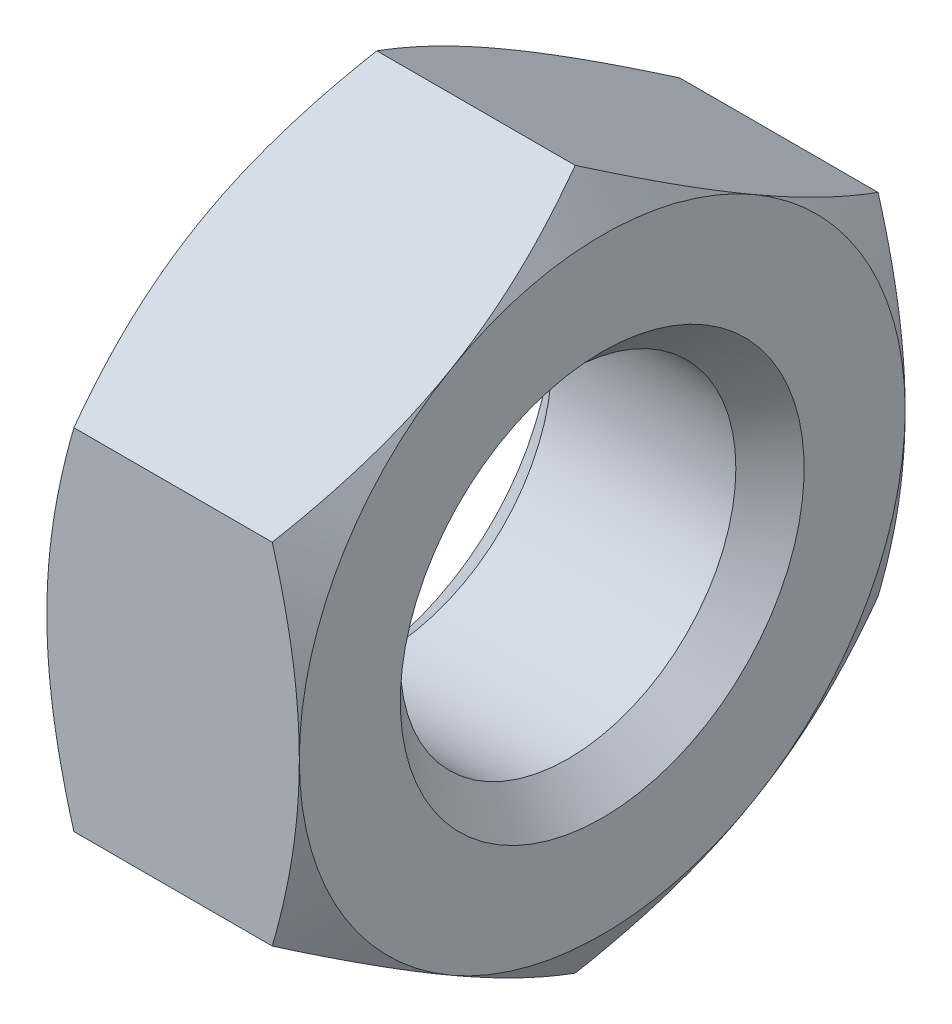
ISO-10303-21;
HEADER;
FILE_DESCRIPTION(('STEP AP214'),'2;1');
FILE_NAME('part.step','',(''),(''),'','','');
FILE_SCHEMA(('AUTOMOTIVE_DESIGN { 1 0 10303 214 1 1 1 1 }'));
ENDSEC;
DATA;
#1=APPLICATION_CONTEXT('core data for automotive mechanical design processes');
#2=APPLICATION_PROTOCOL_DEFINITION('international standard','automotive_design',2000,#1);
#3=PRODUCT_CONTEXT('',#1,'mechanical');
#4=PRODUCT('Part','Part','',(#3));
#5=PRODUCT_RELATED_PRODUCT_CATEGORY('part','',(#4));
#6=PRODUCT_DEFINITION_FORMATION('','',#4);
#7=PRODUCT_DEFINITION_CONTEXT('part definition',#1,'design');
#8=PRODUCT_DEFINITION('design','',#6,#7);
#9=PRODUCT_DEFINITION_SHAPE('','',#8);
#10=(LENGTH_UNIT() NAMED_UNIT(*) SI_UNIT(.MILLI.,.METRE.));
#11=(NAMED_UNIT(*) PLANE_ANGLE_UNIT() SI_UNIT($,.RADIAN.));
#12=(NAMED_UNIT(*) SI_UNIT($,.STERADIAN.) SOLID_ANGLE_UNIT());
#13=UNCERTAINTY_MEASURE_WITH_UNIT(LENGTH_MEASURE(1.E-05),#10,'distance_accuracy_value','');
#14=(GEOMETRIC_REPRESENTATION_CONTEXT(3) GLOBAL_UNCERTAINTY_ASSIGNED_CONTEXT((#13)) GLOBAL_UNIT_ASSIGNED_CONTEXT((#10,
#11,#12)) REPRESENTATION_CONTEXT('',''));
#15=CARTESIAN_POINT('',(0.,0.,0.));
#16=DIRECTION('',(0.,0.,1.));
#17=DIRECTION('',(1.,0.,0.));
#18=AXIS2_PLACEMENT_3D('',#15,#16,#17);
#19=CARTESIAN_POINT('',(-21.5,-5.19615242270663,-3.));
#20=DIRECTION('',(0.,-0.866025403784439,-0.5));
#21=DIRECTION('',(0.,0.5,-0.866025403784439));
#22=AXIS2_PLACEMENT_3D('',#19,#20,#21);
#23=PLANE('',#22);
#24=CARTESIAN_POINT('',(-19.9630642496537,-3.46230554365416,-6.00311088706361));
#25=CARTESIAN_POINT('',(-20.5,-4.3915831052809,-4.3935549359924));
#26=CARTESIAN_POINT('',(-20.5,-5.19615242270663,-3.));
#27=CARTESIAN_POINT('',(-20.5,-6.00072174013237,-1.6064450640076));
#28=CARTESIAN_POINT('',(-19.9630642496537,-6.9299993017591,0.00311088706361198));
#29=(BOUNDED_CURVE() B_SPLINE_CURVE(2,(#24,#25,#26,#27,#28),.UNSPECIFIED.,.F.,
.F.) B_SPLINE_CURVE_WITH_KNOTS((3,2,3),(0.,3.51798983850851,7.03597967701703),
.UNSPECIFIED.) CURVE() GEOMETRIC_REPRESENTATION_ITEM() RATIONAL_B_SPLINE_CURVE((1.,
1.03802697460133,1.,1.03802697460133,1.)) REPRESENTATION_ITEM(''));
#30=CARTESIAN_POINT('',(-19.9641016151377,-3.46410161513775,-6.));
#31=VERTEX_POINT('',#30);
#32=CARTESIAN_POINT('',(-20.5,-5.19615242270663,-3.));
#33=VERTEX_POINT('',#32);
#34=EDGE_CURVE('E227',#31,#33,#29,.T.);
#35=ORIENTED_EDGE('',*,*,#34,.F.);
#36=DIRECTION('',(1.,0.,0.));
#37=VECTOR('',#36,1.);
#38=CARTESIAN_POINT('',(-21.5,-3.46410161513775,-6.));
#39=LINE('',#38,#37);
#40=CARTESIAN_POINT('',(-16.0358983848623,-3.46410161513775,-6.));
#41=VERTEX_POINT('',#40);
#42=EDGE_CURVE('E11',#31,#41,#39,.T.);
#43=ORIENTED_EDGE('',*,*,#42,.T.);
#44=CARTESIAN_POINT('',(-16.0369357503463,-6.9299993017591,0.00311088706361198));
#45=CARTESIAN_POINT('',(-15.5,-6.00072174013237,-1.60644506400761));
#46=CARTESIAN_POINT('',(-15.5,-5.19615242270663,-3.));
#47=CARTESIAN_POINT('',(-15.5,-4.39158310528089,-4.3935549359924));
#48=CARTESIAN_POINT('',(-16.0369357503463,-3.46230554365416,-6.00311088706361));
#49=(BOUNDED_CURVE() B_SPLINE_CURVE(2,(#44,#45,#46,#47,#48),.UNSPECIFIED.,.F.,
.F.) B_SPLINE_CURVE_WITH_KNOTS((3,2,3),(0.,3.51798983850852,7.03597967701703),
.UNSPECIFIED.) CURVE() GEOMETRIC_REPRESENTATION_ITEM() RATIONAL_B_SPLINE_CURVE((1.,
1.03802697460134,1.,1.03802697460135,1.)) REPRESENTATION_ITEM(''));
#50=CARTESIAN_POINT('',(-15.5,-5.19615242270663,-3.));
#51=VERTEX_POINT('',#50);
#52=EDGE_CURVE('E125',#51,#41,#49,.T.);
#53=ORIENTED_EDGE('',*,*,#52,.F.);
#54=CARTESIAN_POINT('',(-16.0369357503463,-6.9299993017591,0.00311088706361198));
#55=CARTESIAN_POINT('',(-15.5,-6.00072174013237,-1.60644506400761));
#56=CARTESIAN_POINT('',(-15.5,-5.19615242270663,-3.));
#57=CARTESIAN_POINT('',(-15.5,-4.39158310528089,-4.3935549359924));
#58=CARTESIAN_POINT('',(-16.0369357503463,-3.46230554365416,-6.00311088706361));
#59=(BOUNDED_CURVE() B_SPLINE_CURVE(2,(#54,#55,#56,#57,#58),.UNSPECIFIED.,.F.,
.F.) B_SPLINE_CURVE_WITH_KNOTS((3,2,3),(0.,3.51798983850852,7.03597967701703),
.UNSPECIFIED.) CURVE() GEOMETRIC_REPRESENTATION_ITEM() RATIONAL_B_SPLINE_CURVE((1.,
1.03802697460134,1.,1.03802697460135,1.)) REPRESENTATION_ITEM(''));
#60=CARTESIAN_POINT('',(-16.0358983848623,-6.92820323027551,0.));
#61=VERTEX_POINT('',#60);
#62=EDGE_CURVE('E205',#61,#51,#59,.T.);
#63=ORIENTED_EDGE('',*,*,#62,.F.);
#64=DIRECTION('',(1.,0.,0.));
#65=VECTOR('',#64,1.);
#66=CARTESIAN_POINT('',(-21.5,-6.92820323027551,0.));
#67=LINE('',#66,#65);
#68=CARTESIAN_POINT('',(-19.9641016151377,-6.92820323027551,0.));
#69=VERTEX_POINT('',#68);
#70=EDGE_CURVE('E179',#69,#61,#67,.T.);
#71=ORIENTED_EDGE('',*,*,#70,.F.);
#72=CARTESIAN_POINT('',(-19.9630642496537,-3.46230554365416,-6.00311088706361));
#73=CARTESIAN_POINT('',(-20.5,-4.3915831052809,-4.3935549359924));
#74=CARTESIAN_POINT('',(-20.5,-5.19615242270663,-3.));
#75=CARTESIAN_POINT('',(-20.5,-6.00072174013237,-1.6064450640076));
#76=CARTESIAN_POINT('',(-19.9630642496537,-6.9299993017591,0.00311088706361198));
#77=(BOUNDED_CURVE() B_SPLINE_CURVE(2,(#72,#73,#74,#75,#76),.UNSPECIFIED.,.F.,
.F.) B_SPLINE_CURVE_WITH_KNOTS((3,2,3),(0.,3.51798983850851,7.03597967701703),
.UNSPECIFIED.) CURVE() GEOMETRIC_REPRESENTATION_ITEM() RATIONAL_B_SPLINE_CURVE((1.,
1.03802697460133,1.,1.03802697460133,1.)) REPRESENTATION_ITEM(''));
#78=EDGE_CURVE('E226',#33,#69,#77,.T.);
#79=ORIENTED_EDGE('',*,*,#78,.F.);
#80=EDGE_LOOP('',(#35,#43,#53,#63,#71,#79));
#81=FACE_BOUND('',#80,.T.);
#82=ADVANCED_FACE('F17',(#81),#23,.T.);
#83=CARTESIAN_POINT('',(-21.5,0.,-6.));
#84=DIRECTION('',(0.,0.,-1.));
#85=DIRECTION('',(0.,1.,0.));
#86=AXIS2_PLACEMENT_3D('',#83,#84,#85);
#87=PLANE('',#86);
#88=CARTESIAN_POINT('',(-19.9630642496537,3.46769375810495,-6.));
#89=CARTESIAN_POINT('',(-20.5,1.60913863485149,-6.));
#90=CARTESIAN_POINT('',(-20.5,0.,-6.));
#91=CARTESIAN_POINT('',(-20.5,-1.60913863485149,-6.));
#92=CARTESIAN_POINT('',(-19.9630642496537,-3.46769375810495,-6.));
#93=(BOUNDED_CURVE() B_SPLINE_CURVE(2,(#88,#89,#90,#91,#92),.UNSPECIFIED.,.F.,
.F.) B_SPLINE_CURVE_WITH_KNOTS((3,2,3),(0.,3.51798983850852,7.03597967701704),
.UNSPECIFIED.) CURVE() GEOMETRIC_REPRESENTATION_ITEM() RATIONAL_B_SPLINE_CURVE((1.,
1.03802697460134,1.,1.03802697460134,1.)) REPRESENTATION_ITEM(''));
#94=CARTESIAN_POINT('',(-19.9641016151377,3.46410161513775,-6.));
#95=VERTEX_POINT('',#94);
#96=CARTESIAN_POINT('',(-20.5,0.,-6.));
#97=VERTEX_POINT('',#96);
#98=EDGE_CURVE('E190',#95,#97,#93,.T.);
#99=ORIENTED_EDGE('',*,*,#98,.F.);
#100=DIRECTION('',(1.,0.,0.));
#101=VECTOR('',#100,1.);
#102=CARTESIAN_POINT('',(-21.5,3.46410161513775,-6.));
#103=LINE('',#102,#101);
#104=CARTESIAN_POINT('',(-16.0358983848623,3.46410161513775,-6.));
#105=VERTEX_POINT('',#104);
#106=EDGE_CURVE('E27',#95,#105,#103,.T.);
#107=ORIENTED_EDGE('',*,*,#106,.T.);
#108=CARTESIAN_POINT('',(-16.0369357503463,-3.46769375810495,-6.));
#109=CARTESIAN_POINT('',(-15.5,-1.60913863485149,-6.));
#110=CARTESIAN_POINT('',(-15.5,0.,-6.));
#111=CARTESIAN_POINT('',(-15.5,1.60913863485149,-6.));
#112=CARTESIAN_POINT('',(-16.0369357503463,3.46769375810495,-6.));
#113=(BOUNDED_CURVE() B_SPLINE_CURVE(2,(#108,#109,#110,#111,#112),.UNSPECIFIED.,.F.,
.F.) B_SPLINE_CURVE_WITH_KNOTS((3,2,3),(0.,3.51798983850852,7.03597967701704),
.UNSPECIFIED.) CURVE() GEOMETRIC_REPRESENTATION_ITEM() RATIONAL_B_SPLINE_CURVE((1.,
1.03802697460134,1.,1.03802697460134,1.)) REPRESENTATION_ITEM(''));
#114=CARTESIAN_POINT('',(-15.5,0.,-6.));
#115=VERTEX_POINT('',#114);
#116=EDGE_CURVE('E129',#115,#105,#113,.T.);
#117=ORIENTED_EDGE('',*,*,#116,.F.);
#118=CARTESIAN_POINT('',(-16.0369357503463,-3.46769375810495,-6.));
#119=CARTESIAN_POINT('',(-15.5,-1.60913863485149,-6.));
#120=CARTESIAN_POINT('',(-15.5,0.,-6.));
#121=CARTESIAN_POINT('',(-15.5,1.60913863485149,-6.));
#122=CARTESIAN_POINT('',(-16.0369357503463,3.46769375810495,-6.));
#123=(BOUNDED_CURVE() B_SPLINE_CURVE(2,(#118,#119,#120,#121,#122),.UNSPECIFIED.,.F.,
.F.) B_SPLINE_CURVE_WITH_KNOTS((3,2,3),(0.,3.51798983850852,7.03597967701704),
.UNSPECIFIED.) CURVE() GEOMETRIC_REPRESENTATION_ITEM() RATIONAL_B_SPLINE_CURVE((1.,
1.03802697460134,1.,1.03802697460134,1.)) REPRESENTATION_ITEM(''));
#124=EDGE_CURVE('E120',#41,#115,#123,.T.);
#125=ORIENTED_EDGE('',*,*,#124,.F.);
#126=ORIENTED_EDGE('',*,*,#42,.F.);
#127=CARTESIAN_POINT('',(-19.9630642496537,3.46769375810495,-6.));
#128=CARTESIAN_POINT('',(-20.5,1.60913863485149,-6.));
#129=CARTESIAN_POINT('',(-20.5,0.,-6.));
#130=CARTESIAN_POINT('',(-20.5,-1.60913863485149,-6.));
#131=CARTESIAN_POINT('',(-19.9630642496537,-3.46769375810495,-6.));
#132=(BOUNDED_CURVE() B_SPLINE_CURVE(2,(#127,#128,#129,#130,#131),.UNSPECIFIED.,.F.,
.F.) B_SPLINE_CURVE_WITH_KNOTS((3,2,3),(0.,3.51798983850852,7.03597967701704),
.UNSPECIFIED.) CURVE() GEOMETRIC_REPRESENTATION_ITEM() RATIONAL_B_SPLINE_CURVE((1.,
1.03802697460134,1.,1.03802697460134,1.)) REPRESENTATION_ITEM(''));
#133=EDGE_CURVE('E248',#97,#31,#132,.T.);
#134=ORIENTED_EDGE('',*,*,#133,.F.);
#135=EDGE_LOOP('',(#99,#107,#117,#125,#126,#134));
#136=FACE_BOUND('',#135,.T.);
#137=ADVANCED_FACE('F131',(#136),#87,.T.);
#138=CARTESIAN_POINT('',(-21.5,5.19615242270663,-3.));
#139=DIRECTION('',(0.,0.866025403784439,-0.5));
#140=DIRECTION('',(0.,0.5,0.866025403784439));
#141=AXIS2_PLACEMENT_3D('',#138,#139,#140);
#142=PLANE('',#141);
#143=CARTESIAN_POINT('',(-19.9630642496537,6.92999930175911,0.0031108870636096));
#144=CARTESIAN_POINT('',(-20.5,6.00072174013237,-1.6064450640076));
#145=CARTESIAN_POINT('',(-20.5,5.19615242270663,-3.));
#146=CARTESIAN_POINT('',(-20.5,4.39158310528089,-4.3935549359924));
#147=CARTESIAN_POINT('',(-19.9630642496537,3.46230554365416,-6.00311088706361));
#148=(BOUNDED_CURVE() B_SPLINE_CURVE(2,(#143,#144,#145,#146,#147),.UNSPECIFIED.,.F.,
.F.) B_SPLINE_CURVE_WITH_KNOTS((3,2,3),(0.,3.51798983850852,7.03597967701703),
.UNSPECIFIED.) CURVE() GEOMETRIC_REPRESENTATION_ITEM() RATIONAL_B_SPLINE_CURVE((1.,
1.03802697460135,1.,1.03802697460135,1.)) REPRESENTATION_ITEM(''));
#149=CARTESIAN_POINT('',(-19.9641016151377,6.92820323027551,0.));
#150=VERTEX_POINT('',#149);
#151=CARTESIAN_POINT('',(-20.5,5.19615242270663,-3.));
#152=VERTEX_POINT('',#151);
#153=EDGE_CURVE('E150',#150,#152,#148,.T.);
#154=ORIENTED_EDGE('',*,*,#153,.F.);
#155=DIRECTION('',(1.,0.,0.));
#156=VECTOR('',#155,1.);
#157=CARTESIAN_POINT('',(-21.5,6.92820323027551,0.));
#158=LINE('',#157,#156);
#159=CARTESIAN_POINT('',(-16.0358983848623,6.92820323027551,0.));
#160=VERTEX_POINT('',#159);
#161=EDGE_CURVE('E143',#150,#160,#158,.T.);
#162=ORIENTED_EDGE('',*,*,#161,.T.);
#163=CARTESIAN_POINT('',(-16.0369357503463,3.46230554365416,-6.00311088706361));
#164=CARTESIAN_POINT('',(-15.5,4.39158310528089,-4.3935549359924));
#165=CARTESIAN_POINT('',(-15.5,5.19615242270663,-3.));
#166=CARTESIAN_POINT('',(-15.5,6.00072174013237,-1.60644506400761));
#167=CARTESIAN_POINT('',(-16.0369357503463,6.92999930175911,0.0031108870636096));
#168=(BOUNDED_CURVE() B_SPLINE_CURVE(2,(#163,#164,#165,#166,#167),.UNSPECIFIED.,.F.,
.F.) B_SPLINE_CURVE_WITH_KNOTS((3,2,3),(0.,3.51798983850851,7.03597967701703),
.UNSPECIFIED.) CURVE() GEOMETRIC_REPRESENTATION_ITEM() RATIONAL_B_SPLINE_CURVE((1.,
1.03802697460133,1.,1.03802697460134,1.)) REPRESENTATION_ITEM(''));
#169=CARTESIAN_POINT('',(-15.5,5.19615242270663,-3.));
#170=VERTEX_POINT('',#169);
#171=EDGE_CURVE('E283',#170,#160,#168,.T.);
#172=ORIENTED_EDGE('',*,*,#171,.F.);
#173=CARTESIAN_POINT('',(-16.0369357503463,3.46230554365416,-6.00311088706361));
#174=CARTESIAN_POINT('',(-15.5,4.39158310528089,-4.3935549359924));
#175=CARTESIAN_POINT('',(-15.5,5.19615242270663,-3.));
#176=CARTESIAN_POINT('',(-15.5,6.00072174013237,-1.60644506400761));
#177=CARTESIAN_POINT('',(-16.0369357503463,6.92999930175911,0.0031108870636096));
#178=(BOUNDED_CURVE() B_SPLINE_CURVE(2,(#173,#174,#175,#176,#177),.UNSPECIFIED.,.F.,
.F.) B_SPLINE_CURVE_WITH_KNOTS((3,2,3),(0.,3.51798983850851,7.03597967701703),
.UNSPECIFIED.) CURVE() GEOMETRIC_REPRESENTATION_ITEM() RATIONAL_B_SPLINE_CURVE((1.,
1.03802697460133,1.,1.03802697460134,1.)) REPRESENTATION_ITEM(''));
#179=EDGE_CURVE('E137',#105,#170,#178,.T.);
#180=ORIENTED_EDGE('',*,*,#179,.F.);
#181=ORIENTED_EDGE('',*,*,#106,.F.);
#182=CARTESIAN_POINT('',(-19.9630642496537,6.92999930175911,0.0031108870636096));
#183=CARTESIAN_POINT('',(-20.5,6.00072174013237,-1.6064450640076));
#184=CARTESIAN_POINT('',(-20.5,5.19615242270663,-3.));
#185=CARTESIAN_POINT('',(-20.5,4.39158310528089,-4.3935549359924));
#186=CARTESIAN_POINT('',(-19.9630642496537,3.46230554365416,-6.00311088706361));
#187=(BOUNDED_CURVE() B_SPLINE_CURVE(2,(#182,#183,#184,#185,#186),.UNSPECIFIED.,.F.,
.F.) B_SPLINE_CURVE_WITH_KNOTS((3,2,3),(0.,3.51798983850852,7.03597967701703),
.UNSPECIFIED.) CURVE() GEOMETRIC_REPRESENTATION_ITEM() RATIONAL_B_SPLINE_CURVE((1.,
1.03802697460135,1.,1.03802697460135,1.)) REPRESENTATION_ITEM(''));
#188=EDGE_CURVE('E178',#152,#95,#187,.T.);
#189=ORIENTED_EDGE('',*,*,#188,.F.);
#190=EDGE_LOOP('',(#154,#162,#172,#180,#181,#189));
#191=FACE_BOUND('',#190,.T.);
#192=ADVANCED_FACE('F417',(#191),#142,.T.);
#193=CARTESIAN_POINT('',(-21.5,-5.19615242270663,3.));
#194=DIRECTION('',(0.,-0.866025403784439,0.5));
#195=DIRECTION('',(0.,-0.5,-0.866025403784439));
#196=AXIS2_PLACEMENT_3D('',#193,#194,#195);
#197=PLANE('',#196);
#198=CARTESIAN_POINT('',(-19.9630642496537,-6.92999930175911,-0.00311088706361293));
#199=CARTESIAN_POINT('',(-20.5,-6.00072174013237,1.6064450640076));
#200=CARTESIAN_POINT('',(-20.5,-5.19615242270663,3.));
#201=CARTESIAN_POINT('',(-20.5,-4.39158310528088,4.3935549359924));
#202=CARTESIAN_POINT('',(-19.9630642496537,-3.46230554365416,6.00311088706362));
#203=(BOUNDED_CURVE() B_SPLINE_CURVE(2,(#198,#199,#200,#201,#202),.UNSPECIFIED.,.F.,
.F.) B_SPLINE_CURVE_WITH_KNOTS((3,2,3),(0.,3.51798983850852,7.03597967701704),
.UNSPECIFIED.) CURVE() GEOMETRIC_REPRESENTATION_ITEM() RATIONAL_B_SPLINE_CURVE((1.,
1.03802697460134,1.,1.03802697460134,1.)) REPRESENTATION_ITEM(''));
#204=CARTESIAN_POINT('',(-20.5,-5.19615242270663,3.));
#205=VERTEX_POINT('',#204);
#206=CARTESIAN_POINT('',(-19.9641016151377,-3.46410161513775,6.));
#207=VERTEX_POINT('',#206);
#208=EDGE_CURVE('E196',#205,#207,#203,.T.);
#209=ORIENTED_EDGE('',*,*,#208,.F.);
#210=CARTESIAN_POINT('',(-19.9630642496537,-6.92999930175911,-0.00311088706361293));
#211=CARTESIAN_POINT('',(-20.5,-6.00072174013237,1.6064450640076));
#212=CARTESIAN_POINT('',(-20.5,-5.19615242270663,3.));
#213=CARTESIAN_POINT('',(-20.5,-4.39158310528088,4.3935549359924));
#214=CARTESIAN_POINT('',(-19.9630642496537,-3.46230554365416,6.00311088706362));
#215=(BOUNDED_CURVE() B_SPLINE_CURVE(2,(#210,#211,#212,#213,#214),.UNSPECIFIED.,.F.,
.F.) B_SPLINE_CURVE_WITH_KNOTS((3,2,3),(0.,3.51798983850852,7.03597967701704),
.UNSPECIFIED.) CURVE() GEOMETRIC_REPRESENTATION_ITEM() RATIONAL_B_SPLINE_CURVE((1.,
1.03802697460134,1.,1.03802697460134,1.)) REPRESENTATION_ITEM(''));
#216=EDGE_CURVE('E216',#69,#205,#215,.T.);
#217=ORIENTED_EDGE('',*,*,#216,.F.);
#218=ORIENTED_EDGE('',*,*,#70,.T.);
#219=CARTESIAN_POINT('',(-16.0369357503463,-3.46230554365416,6.00311088706362));
#220=CARTESIAN_POINT('',(-15.5,-4.39158310528089,4.3935549359924));
#221=CARTESIAN_POINT('',(-15.5,-5.19615242270663,3.));
#222=CARTESIAN_POINT('',(-15.5,-6.00072174013238,1.60644506400761));
#223=CARTESIAN_POINT('',(-16.0369357503463,-6.92999930175911,-0.00311088706361293));
#224=(BOUNDED_CURVE() B_SPLINE_CURVE(2,(#219,#220,#221,#222,#223),.UNSPECIFIED.,.F.,
.F.) B_SPLINE_CURVE_WITH_KNOTS((3,2,3),(0.,3.51798983850852,7.03597967701704),
.UNSPECIFIED.) CURVE() GEOMETRIC_REPRESENTATION_ITEM() RATIONAL_B_SPLINE_CURVE((1.,
1.03802697460134,1.,1.03802697460133,1.)) REPRESENTATION_ITEM(''));
#225=CARTESIAN_POINT('',(-15.5,-5.19615242270663,3.));
#226=VERTEX_POINT('',#225);
#227=EDGE_CURVE('E312',#226,#61,#224,.T.);
#228=ORIENTED_EDGE('',*,*,#227,.F.);
#229=CARTESIAN_POINT('',(-16.0369357503463,-3.46230554365416,6.00311088706362));
#230=CARTESIAN_POINT('',(-15.5,-4.39158310528089,4.3935549359924));
#231=CARTESIAN_POINT('',(-15.5,-5.19615242270663,3.));
#232=CARTESIAN_POINT('',(-15.5,-6.00072174013238,1.60644506400761));
#233=CARTESIAN_POINT('',(-16.0369357503463,-6.92999930175911,-0.00311088706361293));
#234=(BOUNDED_CURVE() B_SPLINE_CURVE(2,(#229,#230,#231,#232,#233),.UNSPECIFIED.,.F.,
.F.) B_SPLINE_CURVE_WITH_KNOTS((3,2,3),(0.,3.51798983850852,7.03597967701704),
.UNSPECIFIED.) CURVE() GEOMETRIC_REPRESENTATION_ITEM() RATIONAL_B_SPLINE_CURVE((1.,
1.03802697460134,1.,1.03802697460133,1.)) REPRESENTATION_ITEM(''));
#235=CARTESIAN_POINT('',(-16.0358983848623,-3.46410161513775,6.));
#236=VERTEX_POINT('',#235);
#237=EDGE_CURVE('E238',#236,#226,#234,.T.);
#238=ORIENTED_EDGE('',*,*,#237,.F.);
#239=DIRECTION('',(1.,0.,0.));
#240=VECTOR('',#239,1.);
#241=CARTESIAN_POINT('',(-21.5,-3.46410161513775,6.));
#242=LINE('',#241,#240);
#243=EDGE_CURVE('E185',#207,#236,#242,.T.);
#244=ORIENTED_EDGE('',*,*,#243,.F.);
#245=EDGE_LOOP('',(#209,#217,#218,#228,#238,#244));
#246=FACE_BOUND('',#245,.T.);
#247=ADVANCED_FACE('F397',(#246),#197,.T.);
#248=CARTESIAN_POINT('',(-21.5,0.,6.));
#249=DIRECTION('',(0.,0.,1.));
#250=DIRECTION('',(0.,-1.,0.));
#251=AXIS2_PLACEMENT_3D('',#248,#249,#250);
#252=PLANE('',#251);
#253=CARTESIAN_POINT('',(-19.9630642496537,-3.46769375810495,6.));
#254=CARTESIAN_POINT('',(-20.5,-1.60913863485149,6.));
#255=CARTESIAN_POINT('',(-20.5,0.,6.));
#256=CARTESIAN_POINT('',(-20.5,1.60913863485149,6.));
#257=CARTESIAN_POINT('',(-19.9630642496537,3.46769375810495,6.));
#258=(BOUNDED_CURVE() B_SPLINE_CURVE(2,(#253,#254,#255,#256,#257),.UNSPECIFIED.,.F.,
.F.) B_SPLINE_CURVE_WITH_KNOTS((3,2,3),(0.,3.51798983850852,7.03597967701704),
.UNSPECIFIED.) CURVE() GEOMETRIC_REPRESENTATION_ITEM() RATIONAL_B_SPLINE_CURVE((1.,
1.03802697460134,1.,1.03802697460134,1.)) REPRESENTATION_ITEM(''));
#259=CARTESIAN_POINT('',(-20.5,0.,6.));
#260=VERTEX_POINT('',#259);
#261=CARTESIAN_POINT('',(-19.9641016151377,3.46410161513776,6.));
#262=VERTEX_POINT('',#261);
#263=EDGE_CURVE('E158',#260,#262,#258,.T.);
#264=ORIENTED_EDGE('',*,*,#263,.F.);
#265=CARTESIAN_POINT('',(-19.9630642496537,-3.46769375810495,6.));
#266=CARTESIAN_POINT('',(-20.5,-1.60913863485149,6.));
#267=CARTESIAN_POINT('',(-20.5,0.,6.));
#268=CARTESIAN_POINT('',(-20.5,1.60913863485149,6.));
#269=CARTESIAN_POINT('',(-19.9630642496537,3.46769375810495,6.));
#270=(BOUNDED_CURVE() B_SPLINE_CURVE(2,(#265,#266,#267,#268,#269),.UNSPECIFIED.,.F.,
.F.) B_SPLINE_CURVE_WITH_KNOTS((3,2,3),(0.,3.51798983850852,7.03597967701704),
.UNSPECIFIED.) CURVE() GEOMETRIC_REPRESENTATION_ITEM() RATIONAL_B_SPLINE_CURVE((1.,
1.03802697460134,1.,1.03802697460134,1.)) REPRESENTATION_ITEM(''));
#271=EDGE_CURVE('E144',#207,#260,#270,.T.);
#272=ORIENTED_EDGE('',*,*,#271,.F.);
#273=ORIENTED_EDGE('',*,*,#243,.T.);
#274=CARTESIAN_POINT('',(-16.0369357503463,3.46769375810495,6.));
#275=CARTESIAN_POINT('',(-15.5,1.60913863485149,6.));
#276=CARTESIAN_POINT('',(-15.5,0.,6.));
#277=CARTESIAN_POINT('',(-15.5,-1.60913863485149,6.));
#278=CARTESIAN_POINT('',(-16.0369357503463,-3.46769375810495,6.));
#279=(BOUNDED_CURVE() B_SPLINE_CURVE(2,(#274,#275,#276,#277,#278),.UNSPECIFIED.,.F.,
.F.) B_SPLINE_CURVE_WITH_KNOTS((3,2,3),(0.,3.51798983850852,7.03597967701704),
.UNSPECIFIED.) CURVE() GEOMETRIC_REPRESENTATION_ITEM() RATIONAL_B_SPLINE_CURVE((1.,
1.03802697460134,1.,1.03802697460135,1.)) REPRESENTATION_ITEM(''));
#280=CARTESIAN_POINT('',(-15.5,0.,6.));
#281=VERTEX_POINT('',#280);
#282=EDGE_CURVE('E211',#281,#236,#279,.T.);
#283=ORIENTED_EDGE('',*,*,#282,.F.);
#284=CARTESIAN_POINT('',(-16.0369357503463,3.46769375810495,6.));
#285=CARTESIAN_POINT('',(-15.5,1.60913863485149,6.));
#286=CARTESIAN_POINT('',(-15.5,0.,6.));
#287=CARTESIAN_POINT('',(-15.5,-1.60913863485149,6.));
#288=CARTESIAN_POINT('',(-16.0369357503463,-3.46769375810495,6.));
#289=(BOUNDED_CURVE() B_SPLINE_CURVE(2,(#284,#285,#286,#287,#288),.UNSPECIFIED.,.F.,
.F.) B_SPLINE_CURVE_WITH_KNOTS((3,2,3),(0.,3.51798983850852,7.03597967701704),
.UNSPECIFIED.) CURVE() GEOMETRIC_REPRESENTATION_ITEM() RATIONAL_B_SPLINE_CURVE((1.,
1.03802697460134,1.,1.03802697460135,1.)) REPRESENTATION_ITEM(''));
#290=CARTESIAN_POINT('',(-16.0358983848623,3.46410161513776,6.));
#291=VERTEX_POINT('',#290);
#292=EDGE_CURVE('E172',#291,#281,#289,.T.);
#293=ORIENTED_EDGE('',*,*,#292,.F.);
#294=DIRECTION('',(1.,0.,0.));
#295=VECTOR('',#294,1.);
#296=CARTESIAN_POINT('',(-21.5,3.46410161513776,6.));
#297=LINE('',#296,#295);
#298=EDGE_CURVE('E306',#262,#291,#297,.T.);
#299=ORIENTED_EDGE('',*,*,#298,.F.);
#300=EDGE_LOOP('',(#264,#272,#273,#283,#293,#299));
#301=FACE_BOUND('',#300,.T.);
#302=ADVANCED_FACE('F376',(#301),#252,.T.);
#303=CARTESIAN_POINT('',(-21.5,5.19615242270663,3.));
#304=DIRECTION('',(0.,0.866025403784439,0.5));
#305=DIRECTION('',(0.,-0.5,0.866025403784439));
#306=AXIS2_PLACEMENT_3D('',#303,#304,#305);
#307=PLANE('',#306);
#308=CARTESIAN_POINT('',(-19.9630642496537,3.46230554365417,6.00311088706361));
#309=CARTESIAN_POINT('',(-20.5,4.3915831052809,4.39355493599239));
#310=CARTESIAN_POINT('',(-20.5,5.19615242270663,3.));
#311=CARTESIAN_POINT('',(-20.5,6.00072174013237,1.60644506400761));
#312=CARTESIAN_POINT('',(-19.9630642496537,6.92999930175911,-0.00311088706361341));
#313=(BOUNDED_CURVE() B_SPLINE_CURVE(2,(#308,#309,#310,#311,#312),.UNSPECIFIED.,.F.,
.F.) B_SPLINE_CURVE_WITH_KNOTS((3,2,3),(0.,3.51798983850852,7.03597967701703),
.UNSPECIFIED.) CURVE() GEOMETRIC_REPRESENTATION_ITEM() RATIONAL_B_SPLINE_CURVE((1.,
1.03802697460134,1.,1.03802697460133,1.)) REPRESENTATION_ITEM(''));
#314=CARTESIAN_POINT('',(-20.5,5.19615242270663,3.));
#315=VERTEX_POINT('',#314);
#316=EDGE_CURVE('E173',#315,#150,#313,.T.);
#317=ORIENTED_EDGE('',*,*,#316,.F.);
#318=CARTESIAN_POINT('',(-19.9630642496537,3.46230554365417,6.00311088706361));
#319=CARTESIAN_POINT('',(-20.5,4.3915831052809,4.39355493599239));
#320=CARTESIAN_POINT('',(-20.5,5.19615242270663,3.));
#321=CARTESIAN_POINT('',(-20.5,6.00072174013237,1.60644506400761));
#322=CARTESIAN_POINT('',(-19.9630642496537,6.92999930175911,-0.00311088706361341));
#323=(BOUNDED_CURVE() B_SPLINE_CURVE(2,(#318,#319,#320,#321,#322),.UNSPECIFIED.,.F.,
.F.) B_SPLINE_CURVE_WITH_KNOTS((3,2,3),(0.,3.51798983850852,7.03597967701703),
.UNSPECIFIED.) CURVE() GEOMETRIC_REPRESENTATION_ITEM() RATIONAL_B_SPLINE_CURVE((1.,
1.03802697460134,1.,1.03802697460133,1.)) REPRESENTATION_ITEM(''));
#324=EDGE_CURVE('E221',#262,#315,#323,.T.);
#325=ORIENTED_EDGE('',*,*,#324,.F.);
#326=ORIENTED_EDGE('',*,*,#298,.T.);
#327=CARTESIAN_POINT('',(-16.0369357503463,6.92999930175911,-0.00311088706361341));
#328=CARTESIAN_POINT('',(-15.5,6.00072174013236,1.60644506400761));
#329=CARTESIAN_POINT('',(-15.5,5.19615242270663,3.));
#330=CARTESIAN_POINT('',(-15.5,4.3915831052809,4.3935549359924));
#331=CARTESIAN_POINT('',(-16.0369357503463,3.46230554365417,6.00311088706361));
#332=(BOUNDED_CURVE() B_SPLINE_CURVE(2,(#327,#328,#329,#330,#331),.UNSPECIFIED.,.F.,
.F.) B_SPLINE_CURVE_WITH_KNOTS((3,2,3),(0.,3.51798983850851,7.03597967701703),
.UNSPECIFIED.) CURVE() GEOMETRIC_REPRESENTATION_ITEM() RATIONAL_B_SPLINE_CURVE((1.,
1.03802697460133,1.,1.03802697460133,1.)) REPRESENTATION_ITEM(''));
#333=CARTESIAN_POINT('',(-15.5,5.19615242270663,3.));
#334=VERTEX_POINT('',#333);
#335=EDGE_CURVE('E171',#334,#291,#332,.T.);
#336=ORIENTED_EDGE('',*,*,#335,.F.);
#337=CARTESIAN_POINT('',(-16.0369357503463,6.92999930175911,-0.00311088706361341));
#338=CARTESIAN_POINT('',(-15.5,6.00072174013236,1.60644506400761));
#339=CARTESIAN_POINT('',(-15.5,5.19615242270663,3.));
#340=CARTESIAN_POINT('',(-15.5,4.3915831052809,4.3935549359924));
#341=CARTESIAN_POINT('',(-16.0369357503463,3.46230554365417,6.00311088706361));
#342=(BOUNDED_CURVE() B_SPLINE_CURVE(2,(#337,#338,#339,#340,#341),.UNSPECIFIED.,.F.,
.F.) B_SPLINE_CURVE_WITH_KNOTS((3,2,3),(0.,3.51798983850851,7.03597967701703),
.UNSPECIFIED.) CURVE() GEOMETRIC_REPRESENTATION_ITEM() RATIONAL_B_SPLINE_CURVE((1.,
1.03802697460133,1.,1.03802697460133,1.)) REPRESENTATION_ITEM(''));
#343=EDGE_CURVE('E134',#160,#334,#342,.T.);
#344=ORIENTED_EDGE('',*,*,#343,.F.);
#345=ORIENTED_EDGE('',*,*,#161,.F.);
#346=EDGE_LOOP('',(#317,#325,#326,#336,#344,#345));
#347=FACE_BOUND('',#346,.T.);
#348=ADVANCED_FACE('F365',(#347),#307,.T.);
#349=CARTESIAN_POINT('',(-20.5,-5.,0.));
#350=DIRECTION('',(-1.,0.,0.));
#351=DIRECTION('',(0.,1.,0.));
#352=AXIS2_PLACEMENT_3D('',#349,#350,#351);
#353=PLANE('',#352);
#354=CARTESIAN_POINT('',(-20.5,0.,0.));
#355=DIRECTION('',(1.,0.,0.));
#356=DIRECTION('',(0.,-1.,0.));
#357=AXIS2_PLACEMENT_3D('',#354,#355,#356);
#358=CIRCLE('',#357,4.);
#359=CARTESIAN_POINT('',(-20.5,-4.,0.));
#360=VERTEX_POINT('',#359);
#361=EDGE_CURVE('E34',#360,#360,#358,.T.);
#362=ORIENTED_EDGE('',*,*,#361,.T.);
#363=EDGE_LOOP('',(#362));
#364=FACE_BOUND('',#363,.T.);
#365=CARTESIAN_POINT('',(-20.5,0.,0.));
#366=DIRECTION('',(1.,0.,0.));
#367=DIRECTION('',(0.,-1.,0.));
#368=AXIS2_PLACEMENT_3D('',#365,#366,#367);
#369=CIRCLE('',#368,6.);
#370=EDGE_CURVE('E139',#205,#33,#369,.T.);
#371=ORIENTED_EDGE('',*,*,#370,.F.);
#372=CARTESIAN_POINT('',(-20.5,0.,0.));
#373=DIRECTION('',(1.,0.,0.));
#374=DIRECTION('',(0.,-1.,0.));
#375=AXIS2_PLACEMENT_3D('',#372,#373,#374);
#376=CIRCLE('',#375,6.);
#377=EDGE_CURVE('E149',#260,#205,#376,.T.);
#378=ORIENTED_EDGE('',*,*,#377,.F.);
#379=CARTESIAN_POINT('',(-20.5,0.,0.));
#380=DIRECTION('',(1.,0.,0.));
#381=DIRECTION('',(0.,-1.,0.));
#382=AXIS2_PLACEMENT_3D('',#379,#380,#381);
#383=CIRCLE('',#382,6.);
#384=EDGE_CURVE('E21',#315,#260,#383,.T.);
#385=ORIENTED_EDGE('',*,*,#384,.F.);
#386=CARTESIAN_POINT('',(-20.5,0.,0.));
#387=DIRECTION('',(1.,0.,0.));
#388=DIRECTION('',(0.,-1.,0.));
#389=AXIS2_PLACEMENT_3D('',#386,#387,#388);
#390=CIRCLE('',#389,6.);
#391=EDGE_CURVE('E157',#152,#315,#390,.T.);
#392=ORIENTED_EDGE('',*,*,#391,.F.);
#393=CARTESIAN_POINT('',(-20.5,0.,0.));
#394=DIRECTION('',(1.,0.,0.));
#395=DIRECTION('',(0.,-1.,0.));
#396=AXIS2_PLACEMENT_3D('',#393,#394,#395);
#397=CIRCLE('',#396,6.);
#398=EDGE_CURVE('E256',#97,#152,#397,.T.);
#399=ORIENTED_EDGE('',*,*,#398,.F.);
#400=CARTESIAN_POINT('',(-20.5,0.,0.));
#401=DIRECTION('',(1.,0.,0.));
#402=DIRECTION('',(0.,-1.,0.));
#403=AXIS2_PLACEMENT_3D('',#400,#401,#402);
#404=CIRCLE('',#403,6.);
#405=EDGE_CURVE('E222',#33,#97,#404,.T.);
#406=ORIENTED_EDGE('',*,*,#405,.F.);
#407=EDGE_LOOP('',(#371,#378,#385,#392,#399,#406));
#408=FACE_BOUND('',#407,.T.);
#409=ADVANCED_FACE('F389',(#364,#408),#353,.T.);
#410=CARTESIAN_POINT('',(-20.16171875,0.,0.));
#411=DIRECTION('',(-1.,0.,0.));
#412=DIRECTION('',(0.,-1.,0.));
#413=AXIS2_PLACEMENT_3D('',#410,#411,#412);
#414=CONICAL_SURFACE('',#413,3.66171875,0.785398163397448);
#415=CARTESIAN_POINT('',(-19.8234375,0.,0.));
#416=DIRECTION('',(1.,0.,0.));
#417=DIRECTION('',(0.,-1.,0.));
#418=AXIS2_PLACEMENT_3D('',#415,#416,#417);
#419=CIRCLE('',#418,3.3234375);
#420=CARTESIAN_POINT('',(-19.8234375,-3.3234375,0.));
#421=VERTEX_POINT('',#420);
#422=EDGE_CURVE('E244',#421,#421,#419,.T.);
#423=ORIENTED_EDGE('',*,*,#422,.T.);
#424=EDGE_LOOP('',(#423));
#425=FACE_BOUND('',#424,.T.);
#426=ORIENTED_EDGE('',*,*,#361,.F.);
#427=EDGE_LOOP('',(#426));
#428=FACE_BOUND('',#427,.T.);
#429=ADVANCED_FACE('F436',(#425,#428),#414,.F.);
#430=CARTESIAN_POINT('',(-18.,0.,0.));
#431=DIRECTION('',(-1.,0.,0.));
#432=DIRECTION('',(0.,-1.,0.));
#433=AXIS2_PLACEMENT_3D('',#430,#431,#432);
#434=CYLINDRICAL_SURFACE('',#433,3.3234375);
#435=CARTESIAN_POINT('',(-16.1765625,0.,0.));
#436=DIRECTION('',(1.,0.,0.));
#437=DIRECTION('',(0.,-1.,0.));
#438=AXIS2_PLACEMENT_3D('',#435,#436,#437);
#439=CIRCLE('',#438,3.3234375);
#440=CARTESIAN_POINT('',(-16.1765625,-3.3234375,0.));
#441=VERTEX_POINT('',#440);
#442=EDGE_CURVE('E239',#441,#441,#439,.T.);
#443=ORIENTED_EDGE('',*,*,#442,.T.);
#444=EDGE_LOOP('',(#443));
#445=FACE_BOUND('',#444,.T.);
#446=ORIENTED_EDGE('',*,*,#422,.F.);
#447=EDGE_LOOP('',(#446));
#448=FACE_BOUND('',#447,.T.);
#449=ADVANCED_FACE('F439',(#445,#448),#434,.F.);
#450=CARTESIAN_POINT('',(-15.83828125,0.,0.));
#451=DIRECTION('',(1.,0.,0.));
#452=DIRECTION('',(0.,-1.,0.));
#453=AXIS2_PLACEMENT_3D('',#450,#451,#452);
#454=CONICAL_SURFACE('',#453,3.66171875,0.785398163397448);
#455=CARTESIAN_POINT('',(-15.5,0.,0.));
#456=DIRECTION('',(1.,0.,0.));
#457=DIRECTION('',(0.,-1.,0.));
#458=AXIS2_PLACEMENT_3D('',#455,#456,#457);
#459=CIRCLE('',#458,4.);
#460=CARTESIAN_POINT('',(-15.5,-4.,0.));
#461=VERTEX_POINT('',#460);
#462=EDGE_CURVE('E119',#461,#461,#459,.T.);
#463=ORIENTED_EDGE('',*,*,#462,.T.);
#464=EDGE_LOOP('',(#463));
#465=FACE_BOUND('',#464,.T.);
#466=ORIENTED_EDGE('',*,*,#442,.F.);
#467=EDGE_LOOP('',(#466));
#468=FACE_BOUND('',#467,.T.);
#469=ADVANCED_FACE('F445',(#465,#468),#454,.F.);
#470=CARTESIAN_POINT('',(-15.5,-5.,0.));
#471=DIRECTION('',(1.,0.,0.));
#472=DIRECTION('',(0.,-1.,0.));
#473=AXIS2_PLACEMENT_3D('',#470,#471,#472);
#474=PLANE('',#473);
#475=CARTESIAN_POINT('',(-15.5,0.,0.));
#476=DIRECTION('',(1.,0.,0.));
#477=DIRECTION('',(0.,-1.,0.));
#478=AXIS2_PLACEMENT_3D('',#475,#476,#477);
#479=CIRCLE('',#478,6.);
#480=EDGE_CURVE('E114',#226,#51,#479,.T.);
#481=ORIENTED_EDGE('',*,*,#480,.T.);
#482=CARTESIAN_POINT('',(-15.5,0.,0.));
#483=DIRECTION('',(1.,0.,0.));
#484=DIRECTION('',(0.,-1.,0.));
#485=AXIS2_PLACEMENT_3D('',#482,#483,#484);
#486=CIRCLE('',#485,6.);
#487=EDGE_CURVE('E105',#51,#115,#486,.T.);
#488=ORIENTED_EDGE('',*,*,#487,.T.);
#489=CARTESIAN_POINT('',(-15.5,0.,0.));
#490=DIRECTION('',(1.,0.,0.));
#491=DIRECTION('',(0.,-1.,0.));
#492=AXIS2_PLACEMENT_3D('',#489,#490,#491);
#493=CIRCLE('',#492,6.);
#494=EDGE_CURVE('E111',#115,#170,#493,.T.);
#495=ORIENTED_EDGE('',*,*,#494,.T.);
#496=CARTESIAN_POINT('',(-15.5,0.,0.));
#497=DIRECTION('',(1.,0.,0.));
#498=DIRECTION('',(0.,-1.,0.));
#499=AXIS2_PLACEMENT_3D('',#496,#497,#498);
#500=CIRCLE('',#499,6.);
#501=EDGE_CURVE('E291',#170,#334,#500,.T.);
#502=ORIENTED_EDGE('',*,*,#501,.T.);
#503=CARTESIAN_POINT('',(-15.5,0.,0.));
#504=DIRECTION('',(1.,0.,0.));
#505=DIRECTION('',(0.,-1.,0.));
#506=AXIS2_PLACEMENT_3D('',#503,#504,#505);
#507=CIRCLE('',#506,6.);
#508=EDGE_CURVE('E165',#334,#281,#507,.T.);
#509=ORIENTED_EDGE('',*,*,#508,.T.);
#510=CARTESIAN_POINT('',(-15.5,0.,0.));
#511=DIRECTION('',(1.,0.,0.));
#512=DIRECTION('',(0.,-1.,0.));
#513=AXIS2_PLACEMENT_3D('',#510,#511,#512);
#514=CIRCLE('',#513,6.);
#515=EDGE_CURVE('E310',#281,#226,#514,.T.);
#516=ORIENTED_EDGE('',*,*,#515,.T.);
#517=EDGE_LOOP('',(#481,#488,#495,#502,#509,#516));
#518=FACE_BOUND('',#517,.T.);
#519=ORIENTED_EDGE('',*,*,#462,.F.);
#520=EDGE_LOOP('',(#519));
#521=FACE_BOUND('',#520,.T.);
#522=ADVANCED_FACE('F107',(#518,#521),#474,.T.);
#523=CARTESIAN_POINT('',(-15.7684678751732,0.,0.));
#524=DIRECTION('',(-1.,0.,0.));
#525=DIRECTION('',(0.,-1.,0.));
#526=AXIS2_PLACEMENT_3D('',#523,#524,#525);
#527=CONICAL_SURFACE('',#526,6.465,1.0471975511966);
#528=ORIENTED_EDGE('',*,*,#52,.T.);
#529=ORIENTED_EDGE('',*,*,#124,.T.);
#530=ORIENTED_EDGE('',*,*,#487,.F.);
#531=EDGE_LOOP('',(#528,#529,#530));
#532=FACE_BOUND('',#531,.T.);
#533=ADVANCED_FACE('F124',(#532),#527,.T.);
#534=CARTESIAN_POINT('',(-15.7684678751732,0.,0.));
#535=DIRECTION('',(-1.,0.,0.));
#536=DIRECTION('',(0.,-1.,0.));
#537=AXIS2_PLACEMENT_3D('',#534,#535,#536);
#538=CONICAL_SURFACE('',#537,6.465,1.0471975511966);
#539=ORIENTED_EDGE('',*,*,#227,.T.);
#540=ORIENTED_EDGE('',*,*,#62,.T.);
#541=ORIENTED_EDGE('',*,*,#480,.F.);
#542=EDGE_LOOP('',(#539,#540,#541));
#543=FACE_BOUND('',#542,.T.);
#544=ADVANCED_FACE('F400',(#543),#538,.T.);
#545=CARTESIAN_POINT('',(-15.7684678751732,0.,0.));
#546=DIRECTION('',(-1.,0.,0.));
#547=DIRECTION('',(0.,-1.,0.));
#548=AXIS2_PLACEMENT_3D('',#545,#546,#547);
#549=CONICAL_SURFACE('',#548,6.465,1.0471975511966);
#550=ORIENTED_EDGE('',*,*,#282,.T.);
#551=ORIENTED_EDGE('',*,*,#237,.T.);
#552=ORIENTED_EDGE('',*,*,#515,.F.);
#553=EDGE_LOOP('',(#550,#551,#552));
#554=FACE_BOUND('',#553,.T.);
#555=ADVANCED_FACE('F398',(#554),#549,.T.);
#556=CARTESIAN_POINT('',(-15.7684678751732,0.,0.));
#557=DIRECTION('',(-1.,0.,0.));
#558=DIRECTION('',(0.,-1.,0.));
#559=AXIS2_PLACEMENT_3D('',#556,#557,#558);
#560=CONICAL_SURFACE('',#559,6.465,1.0471975511966);
#561=ORIENTED_EDGE('',*,*,#292,.T.);
#562=ORIENTED_EDGE('',*,*,#508,.F.);
#563=ORIENTED_EDGE('',*,*,#335,.T.);
#564=EDGE_LOOP('',(#561,#562,#563));
#565=FACE_BOUND('',#564,.T.);
#566=ADVANCED_FACE('F368',(#565),#560,.T.);
#567=CARTESIAN_POINT('',(-15.7684678751732,0.,0.));
#568=DIRECTION('',(-1.,0.,0.));
#569=DIRECTION('',(0.,-1.,0.));
#570=AXIS2_PLACEMENT_3D('',#567,#568,#569);
#571=CONICAL_SURFACE('',#570,6.465,1.0471975511966);
#572=ORIENTED_EDGE('',*,*,#343,.T.);
#573=ORIENTED_EDGE('',*,*,#501,.F.);
#574=ORIENTED_EDGE('',*,*,#171,.T.);
#575=EDGE_LOOP('',(#572,#573,#574));
#576=FACE_BOUND('',#575,.T.);
#577=ADVANCED_FACE('F361',(#576),#571,.T.);
#578=CARTESIAN_POINT('',(-15.7684678751732,0.,0.));
#579=DIRECTION('',(-1.,0.,0.));
#580=DIRECTION('',(0.,-1.,0.));
#581=AXIS2_PLACEMENT_3D('',#578,#579,#580);
#582=CONICAL_SURFACE('',#581,6.465,1.0471975511966);
#583=ORIENTED_EDGE('',*,*,#179,.T.);
#584=ORIENTED_EDGE('',*,*,#494,.F.);
#585=ORIENTED_EDGE('',*,*,#116,.T.);
#586=EDGE_LOOP('',(#583,#584,#585));
#587=FACE_BOUND('',#586,.T.);
#588=ADVANCED_FACE('F136',(#587),#582,.T.);
#589=CARTESIAN_POINT('',(-20.2315321248268,0.,0.));
#590=DIRECTION('',(1.,0.,0.));
#591=DIRECTION('',(0.,-1.,0.));
#592=AXIS2_PLACEMENT_3D('',#589,#590,#591);
#593=CONICAL_SURFACE('',#592,6.465,1.0471975511966);
#594=ORIENTED_EDGE('',*,*,#78,.T.);
#595=ORIENTED_EDGE('',*,*,#216,.T.);
#596=ORIENTED_EDGE('',*,*,#370,.T.);
#597=EDGE_LOOP('',(#594,#595,#596));
#598=FACE_BOUND('',#597,.T.);
#599=ADVANCED_FACE('F459',(#598),#593,.T.);
#600=CARTESIAN_POINT('',(-20.2315321248268,0.,0.));
#601=DIRECTION('',(1.,0.,0.));
#602=DIRECTION('',(0.,-1.,0.));
#603=AXIS2_PLACEMENT_3D('',#600,#601,#602);
#604=CONICAL_SURFACE('',#603,6.465,1.0471975511966);
#605=ORIENTED_EDGE('',*,*,#133,.T.);
#606=ORIENTED_EDGE('',*,*,#34,.T.);
#607=ORIENTED_EDGE('',*,*,#405,.T.);
#608=EDGE_LOOP('',(#605,#606,#607));
#609=FACE_BOUND('',#608,.T.);
#610=ADVANCED_FACE('F19',(#609),#604,.T.);
#611=CARTESIAN_POINT('',(-20.2315321248268,0.,0.));
#612=DIRECTION('',(1.,0.,0.));
#613=DIRECTION('',(0.,-1.,0.));
#614=AXIS2_PLACEMENT_3D('',#611,#612,#613);
#615=CONICAL_SURFACE('',#614,6.465,1.0471975511966);
#616=ORIENTED_EDGE('',*,*,#188,.T.);
#617=ORIENTED_EDGE('',*,*,#98,.T.);
#618=ORIENTED_EDGE('',*,*,#398,.T.);
#619=EDGE_LOOP('',(#616,#617,#618));
#620=FACE_BOUND('',#619,.T.);
#621=ADVANCED_FACE('F427',(#620),#615,.T.);
#622=CARTESIAN_POINT('',(-20.2315321248268,0.,0.));
#623=DIRECTION('',(1.,0.,0.));
#624=DIRECTION('',(0.,-1.,0.));
#625=AXIS2_PLACEMENT_3D('',#622,#623,#624);
#626=CONICAL_SURFACE('',#625,6.465,1.0471975511966);
#627=ORIENTED_EDGE('',*,*,#153,.T.);
#628=ORIENTED_EDGE('',*,*,#391,.T.);
#629=ORIENTED_EDGE('',*,*,#316,.T.);
#630=EDGE_LOOP('',(#627,#628,#629));
#631=FACE_BOUND('',#630,.T.);
#632=ADVANCED_FACE('F386',(#631),#626,.T.);
#633=CARTESIAN_POINT('',(-20.2315321248268,0.,0.));
#634=DIRECTION('',(1.,0.,0.));
#635=DIRECTION('',(0.,-1.,0.));
#636=AXIS2_PLACEMENT_3D('',#633,#634,#635);
#637=CONICAL_SURFACE('',#636,6.465,1.0471975511966);
#638=ORIENTED_EDGE('',*,*,#324,.T.);
#639=ORIENTED_EDGE('',*,*,#384,.T.);
#640=ORIENTED_EDGE('',*,*,#263,.T.);
#641=EDGE_LOOP('',(#638,#639,#640));
#642=FACE_BOUND('',#641,.T.);
#643=ADVANCED_FACE('F380',(#642),#637,.T.);
#644=CARTESIAN_POINT('',(-20.2315321248268,0.,0.));
#645=DIRECTION('',(1.,0.,0.));
#646=DIRECTION('',(0.,-1.,0.));
#647=AXIS2_PLACEMENT_3D('',#644,#645,#646);
#648=CONICAL_SURFACE('',#647,6.465,1.0471975511966);
#649=ORIENTED_EDGE('',*,*,#271,.T.);
#650=ORIENTED_EDGE('',*,*,#377,.T.);
#651=ORIENTED_EDGE('',*,*,#208,.T.);
#652=EDGE_LOOP('',(#649,#650,#651));
#653=FACE_BOUND('',#652,.T.);
#654=ADVANCED_FACE('F392',(#653),#648,.T.);
#655=CLOSED_SHELL('',(#82,#137,#192,#247,#302,#348,#409,#429,#449,#469,#522,#533,#544,#555,#566,
#577,#588,#599,#610,#621,#632,#643,#654));
#656=MANIFOLD_SOLID_BREP('B1',#655);
#657=ADVANCED_BREP_SHAPE_REPRESENTATION('',(#18,#656),#14);
#658=SHAPE_DEFINITION_REPRESENTATION(#9,#657);
ENDSEC;
END-ISO-10303-21;
